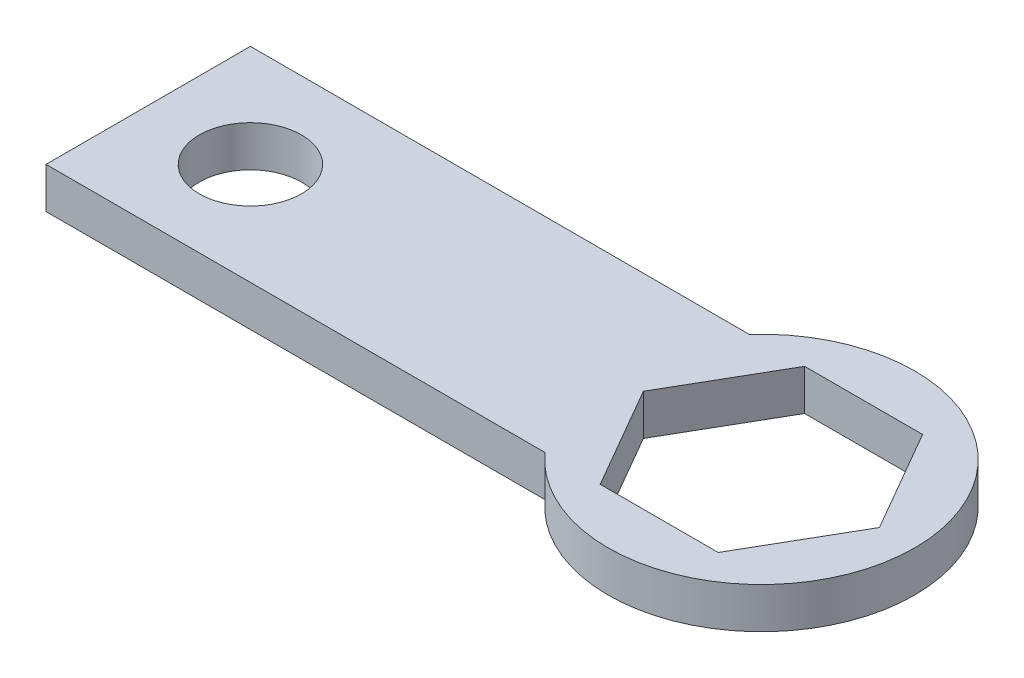
ISO-10303-21;
HEADER;
FILE_DESCRIPTION(('STEP AP214'),'2;1');
FILE_NAME('part.step','',(''),(''),'','','');
FILE_SCHEMA(('AUTOMOTIVE_DESIGN { 1 0 10303 214 1 1 1 1 }'));
ENDSEC;
DATA;
#1=APPLICATION_CONTEXT('core data for automotive mechanical design processes');
#2=APPLICATION_PROTOCOL_DEFINITION('international standard','automotive_design',2000,#1);
#3=PRODUCT_CONTEXT('',#1,'mechanical');
#4=PRODUCT('Part','Part','',(#3));
#5=PRODUCT_RELATED_PRODUCT_CATEGORY('part','',(#4));
#6=PRODUCT_DEFINITION_FORMATION('','',#4);
#7=PRODUCT_DEFINITION_CONTEXT('part definition',#1,'design');
#8=PRODUCT_DEFINITION('design','',#6,#7);
#9=PRODUCT_DEFINITION_SHAPE('','',#8);
#10=(LENGTH_UNIT() NAMED_UNIT(*) SI_UNIT(.MILLI.,.METRE.));
#11=(NAMED_UNIT(*) PLANE_ANGLE_UNIT() SI_UNIT($,.RADIAN.));
#12=(NAMED_UNIT(*) SI_UNIT($,.STERADIAN.) SOLID_ANGLE_UNIT());
#13=UNCERTAINTY_MEASURE_WITH_UNIT(LENGTH_MEASURE(1.E-05),#10,'distance_accuracy_value','');
#14=(GEOMETRIC_REPRESENTATION_CONTEXT(3) GLOBAL_UNCERTAINTY_ASSIGNED_CONTEXT((#13)) GLOBAL_UNIT_ASSIGNED_CONTEXT((#10,
#11,#12)) REPRESENTATION_CONTEXT('',''));
#15=CARTESIAN_POINT('',(0.,0.,0.));
#16=DIRECTION('',(0.,0.,1.));
#17=DIRECTION('',(1.,0.,0.));
#18=AXIS2_PLACEMENT_3D('',#15,#16,#17);
#19=CARTESIAN_POINT('',(0.,1.27,0.));
#20=DIRECTION('',(0.,-1.,0.));
#21=DIRECTION('',(0.,0.,-1.));
#22=AXIS2_PLACEMENT_3D('',#19,#20,#21);
#23=CYLINDRICAL_SURFACE('',#22,4.7625);
#24=CARTESIAN_POINT('',(0.,0.,0.));
#25=DIRECTION('',(0.,1.,0.));
#26=DIRECTION('',(0.,0.,1.));
#27=AXIS2_PLACEMENT_3D('',#24,#25,#26);
#28=CIRCLE('',#27,4.7625);
#29=CARTESIAN_POINT('',(-3.54975791428092,0.,3.175));
#30=VERTEX_POINT('',#29);
#31=CARTESIAN_POINT('',(-3.54975791428092,0.,-3.175));
#32=VERTEX_POINT('',#31);
#33=EDGE_CURVE('E162',#30,#32,#28,.T.);
#34=ORIENTED_EDGE('',*,*,#33,.T.);
#35=DIRECTION('',(0.,-1.,0.));
#36=VECTOR('',#35,1.);
#37=CARTESIAN_POINT('',(-3.54975791428092,1.27,-3.175));
#38=LINE('',#37,#36);
#39=CARTESIAN_POINT('',(-3.54975791428092,1.27,-3.175));
#40=VERTEX_POINT('',#39);
#41=EDGE_CURVE('E218',#40,#32,#38,.T.);
#42=ORIENTED_EDGE('',*,*,#41,.F.);
#43=CARTESIAN_POINT('',(0.,1.27,0.));
#44=DIRECTION('',(0.,1.,0.));
#45=DIRECTION('',(0.,0.,1.));
#46=AXIS2_PLACEMENT_3D('',#43,#44,#45);
#47=CIRCLE('',#46,4.7625);
#48=CARTESIAN_POINT('',(-3.54975791428092,1.27,3.175));
#49=VERTEX_POINT('',#48);
#50=EDGE_CURVE('E173',#49,#40,#47,.T.);
#51=ORIENTED_EDGE('',*,*,#50,.F.);
#52=DIRECTION('',(0.,-1.,0.));
#53=VECTOR('',#52,1.);
#54=CARTESIAN_POINT('',(-3.54975791428092,1.27,3.175));
#55=LINE('',#54,#53);
#56=EDGE_CURVE('E191',#49,#30,#55,.T.);
#57=ORIENTED_EDGE('',*,*,#56,.T.);
#58=EDGE_LOOP('',(#34,#42,#51,#57));
#59=FACE_BOUND('',#58,.T.);
#60=ADVANCED_FACE('F45',(#59),#23,.T.);
#61=CARTESIAN_POINT('',(0.,1.27,-3.175));
#62=DIRECTION('',(0.,0.,1.));
#63=DIRECTION('',(1.,0.,0.));
#64=AXIS2_PLACEMENT_3D('',#61,#62,#63);
#65=PLANE('',#64);
#66=DIRECTION('',(-1.,0.,0.));
#67=VECTOR('',#66,1.);
#68=CARTESIAN_POINT('',(0.,0.,-3.175));
#69=LINE('',#68,#67);
#70=CARTESIAN_POINT('',(-19.05,0.,-3.175));
#71=VERTEX_POINT('',#70);
#72=EDGE_CURVE('E195',#32,#71,#69,.T.);
#73=ORIENTED_EDGE('',*,*,#72,.T.);
#74=DIRECTION('',(0.,-1.,0.));
#75=VECTOR('',#74,1.);
#76=CARTESIAN_POINT('',(-19.05,1.27,-3.175));
#77=LINE('',#76,#75);
#78=CARTESIAN_POINT('',(-19.05,1.27,-3.175));
#79=VERTEX_POINT('',#78);
#80=EDGE_CURVE('E214',#79,#71,#77,.T.);
#81=ORIENTED_EDGE('',*,*,#80,.F.);
#82=DIRECTION('',(-1.,0.,0.));
#83=VECTOR('',#82,1.);
#84=CARTESIAN_POINT('',(0.,1.27,-3.175));
#85=LINE('',#84,#83);
#86=EDGE_CURVE('E177',#40,#79,#85,.T.);
#87=ORIENTED_EDGE('',*,*,#86,.F.);
#88=ORIENTED_EDGE('',*,*,#41,.T.);
#89=EDGE_LOOP('',(#73,#81,#87,#88));
#90=FACE_BOUND('',#89,.T.);
#91=ADVANCED_FACE('F262',(#90),#65,.F.);
#92=CARTESIAN_POINT('',(-19.05,1.27,0.));
#93=DIRECTION('',(1.,0.,0.));
#94=DIRECTION('',(0.,0.,-1.));
#95=AXIS2_PLACEMENT_3D('',#92,#93,#94);
#96=PLANE('',#95);
#97=DIRECTION('',(0.,0.,1.));
#98=VECTOR('',#97,1.);
#99=CARTESIAN_POINT('',(-19.05,0.,0.));
#100=LINE('',#99,#98);
#101=CARTESIAN_POINT('',(-19.05,0.,3.175));
#102=VERTEX_POINT('',#101);
#103=EDGE_CURVE('E198',#71,#102,#100,.T.);
#104=ORIENTED_EDGE('',*,*,#103,.T.);
#105=DIRECTION('',(0.,-1.,0.));
#106=VECTOR('',#105,1.);
#107=CARTESIAN_POINT('',(-19.05,1.27,3.175));
#108=LINE('',#107,#106);
#109=CARTESIAN_POINT('',(-19.05,1.27,3.175));
#110=VERTEX_POINT('',#109);
#111=EDGE_CURVE('E210',#110,#102,#108,.T.);
#112=ORIENTED_EDGE('',*,*,#111,.F.);
#113=DIRECTION('',(0.,0.,1.));
#114=VECTOR('',#113,1.);
#115=CARTESIAN_POINT('',(-19.05,1.27,0.));
#116=LINE('',#115,#114);
#117=EDGE_CURVE('E181',#79,#110,#116,.T.);
#118=ORIENTED_EDGE('',*,*,#117,.F.);
#119=ORIENTED_EDGE('',*,*,#80,.T.);
#120=EDGE_LOOP('',(#104,#112,#118,#119));
#121=FACE_BOUND('',#120,.T.);
#122=ADVANCED_FACE('F267',(#121),#96,.F.);
#123=CARTESIAN_POINT('',(0.,1.27,3.175));
#124=DIRECTION('',(0.,0.,-1.));
#125=DIRECTION('',(-1.,0.,0.));
#126=AXIS2_PLACEMENT_3D('',#123,#124,#125);
#127=PLANE('',#126);
#128=DIRECTION('',(1.,0.,0.));
#129=VECTOR('',#128,1.);
#130=CARTESIAN_POINT('',(0.,0.,3.175));
#131=LINE('',#130,#129);
#132=EDGE_CURVE('E201',#102,#30,#131,.T.);
#133=ORIENTED_EDGE('',*,*,#132,.T.);
#134=ORIENTED_EDGE('',*,*,#56,.F.);
#135=DIRECTION('',(1.,0.,0.));
#136=VECTOR('',#135,1.);
#137=CARTESIAN_POINT('',(0.,1.27,3.175));
#138=LINE('',#137,#136);
#139=EDGE_CURVE('E184',#110,#49,#138,.T.);
#140=ORIENTED_EDGE('',*,*,#139,.F.);
#141=ORIENTED_EDGE('',*,*,#111,.T.);
#142=EDGE_LOOP('',(#133,#134,#140,#141));
#143=FACE_BOUND('',#142,.T.);
#144=ADVANCED_FACE('F282',(#143),#127,.F.);
#145=CARTESIAN_POINT('',(-15.875,1.27,0.));
#146=DIRECTION('',(0.,-1.,0.));
#147=DIRECTION('',(0.,0.,-1.));
#148=AXIS2_PLACEMENT_3D('',#145,#146,#147);
#149=CYLINDRICAL_SURFACE('',#148,1.5875);
#150=CARTESIAN_POINT('',(-15.875,1.27,0.));
#151=DIRECTION('',(0.,1.,0.));
#152=DIRECTION('',(0.,0.,1.));
#153=AXIS2_PLACEMENT_3D('',#150,#151,#152);
#154=CIRCLE('',#153,1.5875);
#155=CARTESIAN_POINT('',(-15.875,1.27,1.5875));
#156=VERTEX_POINT('',#155);
#157=EDGE_CURVE('E187',#156,#156,#154,.T.);
#158=ORIENTED_EDGE('',*,*,#157,.T.);
#159=EDGE_LOOP('',(#158));
#160=FACE_BOUND('',#159,.T.);
#161=CARTESIAN_POINT('',(-15.875,0.,0.));
#162=DIRECTION('',(0.,1.,0.));
#163=DIRECTION('',(0.,0.,1.));
#164=AXIS2_PLACEMENT_3D('',#161,#162,#163);
#165=CIRCLE('',#164,1.5875);
#166=CARTESIAN_POINT('',(-15.875,0.,1.5875));
#167=VERTEX_POINT('',#166);
#168=EDGE_CURVE('E178',#167,#167,#165,.T.);
#169=ORIENTED_EDGE('',*,*,#168,.F.);
#170=EDGE_LOOP('',(#169));
#171=FACE_BOUND('',#170,.T.);
#172=ADVANCED_FACE('F289',(#160,#171),#149,.F.);
#173=CARTESIAN_POINT('',(0.,1.27,0.));
#174=DIRECTION('',(0.,1.,0.));
#175=DIRECTION('',(0.,0.,1.));
#176=AXIS2_PLACEMENT_3D('',#173,#174,#175);
#177=PLANE('',#176);
#178=DIRECTION('',(0.5,0.,-0.866025403784439));
#179=VECTOR('',#178,1.);
#180=CARTESIAN_POINT('',(1.83308710467706,1.27,3.175));
#181=LINE('',#180,#179);
#182=CARTESIAN_POINT('',(1.83308710467706,1.27,3.175));
#183=VERTEX_POINT('',#182);
#184=CARTESIAN_POINT('',(3.66617420935412,1.27,0.));
#185=VERTEX_POINT('',#184);
#186=EDGE_CURVE('E60',#183,#185,#181,.T.);
#187=ORIENTED_EDGE('',*,*,#186,.F.);
#188=DIRECTION('',(1.,0.,0.));
#189=VECTOR('',#188,1.);
#190=CARTESIAN_POINT('',(-1.83308710467706,1.27,3.175));
#191=LINE('',#190,#189);
#192=CARTESIAN_POINT('',(-1.83308710467706,1.27,3.175));
#193=VERTEX_POINT('',#192);
#194=EDGE_CURVE('E155',#193,#183,#191,.T.);
#195=ORIENTED_EDGE('',*,*,#194,.F.);
#196=DIRECTION('',(0.5,0.,0.866025403784439));
#197=VECTOR('',#196,1.);
#198=CARTESIAN_POINT('',(-3.66617420935412,1.27,0.));
#199=LINE('',#198,#197);
#200=CARTESIAN_POINT('',(-3.66617420935412,1.27,0.));
#201=VERTEX_POINT('',#200);
#202=EDGE_CURVE('E148',#201,#193,#199,.T.);
#203=ORIENTED_EDGE('',*,*,#202,.F.);
#204=DIRECTION('',(-0.5,0.,0.866025403784439));
#205=VECTOR('',#204,1.);
#206=CARTESIAN_POINT('',(-1.83308710467706,1.27,-3.175));
#207=LINE('',#206,#205);
#208=CARTESIAN_POINT('',(-1.83308710467706,1.27,-3.175));
#209=VERTEX_POINT('',#208);
#210=EDGE_CURVE('E144',#209,#201,#207,.T.);
#211=ORIENTED_EDGE('',*,*,#210,.F.);
#212=DIRECTION('',(-1.,0.,0.));
#213=VECTOR('',#212,1.);
#214=CARTESIAN_POINT('',(1.83308710467706,1.27,-3.175));
#215=LINE('',#214,#213);
#216=CARTESIAN_POINT('',(1.83308710467706,1.27,-3.175));
#217=VERTEX_POINT('',#216);
#218=EDGE_CURVE('E125',#217,#209,#215,.T.);
#219=ORIENTED_EDGE('',*,*,#218,.F.);
#220=DIRECTION('',(-0.5,0.,-0.866025403784438));
#221=VECTOR('',#220,1.);
#222=CARTESIAN_POINT('',(3.66617420935412,1.27,0.));
#223=LINE('',#222,#221);
#224=EDGE_CURVE('E135',#185,#217,#223,.T.);
#225=ORIENTED_EDGE('',*,*,#224,.F.);
#226=EDGE_LOOP('',(#187,#195,#203,#211,#219,#225));
#227=FACE_BOUND('',#226,.T.);
#228=ORIENTED_EDGE('',*,*,#50,.T.);
#229=ORIENTED_EDGE('',*,*,#86,.T.);
#230=ORIENTED_EDGE('',*,*,#117,.T.);
#231=ORIENTED_EDGE('',*,*,#139,.T.);
#232=EDGE_LOOP('',(#228,#229,#230,#231));
#233=FACE_BOUND('',#232,.T.);
#234=ORIENTED_EDGE('',*,*,#157,.F.);
#235=EDGE_LOOP('',(#234));
#236=FACE_BOUND('',#235,.T.);
#237=ADVANCED_FACE('F140',(#227,#233,#236),#177,.T.);
#238=CARTESIAN_POINT('',(0.,0.,0.));
#239=DIRECTION('',(0.,1.,0.));
#240=DIRECTION('',(0.,0.,1.));
#241=AXIS2_PLACEMENT_3D('',#238,#239,#240);
#242=PLANE('',#241);
#243=DIRECTION('',(1.,0.,0.));
#244=VECTOR('',#243,1.);
#245=CARTESIAN_POINT('',(0.,0.,3.175));
#246=LINE('',#245,#244);
#247=CARTESIAN_POINT('',(-1.83308710467706,0.,3.175));
#248=VERTEX_POINT('',#247);
#249=CARTESIAN_POINT('',(1.83308710467706,0.,3.175));
#250=VERTEX_POINT('',#249);
#251=EDGE_CURVE('E53',#248,#250,#246,.T.);
#252=ORIENTED_EDGE('',*,*,#251,.T.);
#253=DIRECTION('',(0.5,0.,-0.866025403784439));
#254=VECTOR('',#253,1.);
#255=CARTESIAN_POINT('',(2.74963065701559,0.,1.5875));
#256=LINE('',#255,#254);
#257=CARTESIAN_POINT('',(3.66617420935412,0.,0.));
#258=VERTEX_POINT('',#257);
#259=EDGE_CURVE('E11',#250,#258,#256,.T.);
#260=ORIENTED_EDGE('',*,*,#259,.T.);
#261=DIRECTION('',(-0.5,0.,-0.866025403784438));
#262=VECTOR('',#261,1.);
#263=CARTESIAN_POINT('',(2.74963065701559,0.,-1.5875));
#264=LINE('',#263,#262);
#265=CARTESIAN_POINT('',(1.83308710467706,0.,-3.175));
#266=VERTEX_POINT('',#265);
#267=EDGE_CURVE('E222',#258,#266,#264,.T.);
#268=ORIENTED_EDGE('',*,*,#267,.T.);
#269=DIRECTION('',(-1.,0.,0.));
#270=VECTOR('',#269,1.);
#271=CARTESIAN_POINT('',(0.,0.,-3.175));
#272=LINE('',#271,#270);
#273=CARTESIAN_POINT('',(-1.83308710467706,0.,-3.175));
#274=VERTEX_POINT('',#273);
#275=EDGE_CURVE('E128',#266,#274,#272,.T.);
#276=ORIENTED_EDGE('',*,*,#275,.T.);
#277=DIRECTION('',(-0.5,0.,0.866025403784439));
#278=VECTOR('',#277,1.);
#279=CARTESIAN_POINT('',(-2.74963065701559,0.,-1.5875));
#280=LINE('',#279,#278);
#281=CARTESIAN_POINT('',(-3.66617420935412,0.,0.));
#282=VERTEX_POINT('',#281);
#283=EDGE_CURVE('E227',#274,#282,#280,.T.);
#284=ORIENTED_EDGE('',*,*,#283,.T.);
#285=DIRECTION('',(0.5,0.,0.866025403784439));
#286=VECTOR('',#285,1.);
#287=CARTESIAN_POINT('',(-2.74963065701559,0.,1.5875));
#288=LINE('',#287,#286);
#289=EDGE_CURVE('E231',#282,#248,#288,.T.);
#290=ORIENTED_EDGE('',*,*,#289,.T.);
#291=EDGE_LOOP('',(#252,#260,#268,#276,#284,#290));
#292=FACE_BOUND('',#291,.T.);
#293=ORIENTED_EDGE('',*,*,#33,.F.);
#294=ORIENTED_EDGE('',*,*,#132,.F.);
#295=ORIENTED_EDGE('',*,*,#103,.F.);
#296=ORIENTED_EDGE('',*,*,#72,.F.);
#297=EDGE_LOOP('',(#293,#294,#295,#296));
#298=FACE_BOUND('',#297,.T.);
#299=ORIENTED_EDGE('',*,*,#168,.T.);
#300=EDGE_LOOP('',(#299));
#301=FACE_BOUND('',#300,.T.);
#302=ADVANCED_FACE('F237',(#292,#298,#301),#242,.F.);
#303=CARTESIAN_POINT('',(1.83308710467706,-1.27,3.175));
#304=DIRECTION('',(0.866025403784439,0.,0.5));
#305=DIRECTION('',(0.5,0.,-0.866025403784439));
#306=AXIS2_PLACEMENT_3D('',#303,#304,#305);
#307=PLANE('',#306);
#308=DIRECTION('',(0.,1.,0.));
#309=VECTOR('',#308,1.);
#310=CARTESIAN_POINT('',(1.83308710467706,-1.27,3.175));
#311=LINE('',#310,#309);
#312=EDGE_CURVE('E159',#250,#183,#311,.T.);
#313=ORIENTED_EDGE('',*,*,#312,.T.);
#314=ORIENTED_EDGE('',*,*,#186,.T.);
#315=DIRECTION('',(0.,1.,0.));
#316=VECTOR('',#315,1.);
#317=CARTESIAN_POINT('',(3.66617420935412,-1.27,0.));
#318=LINE('',#317,#316);
#319=EDGE_CURVE('E132',#258,#185,#318,.T.);
#320=ORIENTED_EDGE('',*,*,#319,.F.);
#321=ORIENTED_EDGE('',*,*,#259,.F.);
#322=EDGE_LOOP('',(#313,#314,#320,#321));
#323=FACE_BOUND('',#322,.T.);
#324=ADVANCED_FACE('F250',(#323),#307,.F.);
#325=CARTESIAN_POINT('',(-1.83308710467706,-1.27,3.175));
#326=DIRECTION('',(0.,0.,1.));
#327=DIRECTION('',(1.,0.,0.));
#328=AXIS2_PLACEMENT_3D('',#325,#326,#327);
#329=PLANE('',#328);
#330=DIRECTION('',(0.,1.,0.));
#331=VECTOR('',#330,1.);
#332=CARTESIAN_POINT('',(-1.83308710467706,-1.27,3.175));
#333=LINE('',#332,#331);
#334=EDGE_CURVE('E163',#248,#193,#333,.T.);
#335=ORIENTED_EDGE('',*,*,#334,.T.);
#336=ORIENTED_EDGE('',*,*,#194,.T.);
#337=ORIENTED_EDGE('',*,*,#312,.F.);
#338=ORIENTED_EDGE('',*,*,#251,.F.);
#339=EDGE_LOOP('',(#335,#336,#337,#338));
#340=FACE_BOUND('',#339,.T.);
#341=ADVANCED_FACE('F242',(#340),#329,.F.);
#342=CARTESIAN_POINT('',(-3.66617420935412,-1.27,0.));
#343=DIRECTION('',(-0.866025403784439,0.,0.5));
#344=DIRECTION('',(0.5,0.,0.866025403784439));
#345=AXIS2_PLACEMENT_3D('',#342,#343,#344);
#346=PLANE('',#345);
#347=DIRECTION('',(0.,1.,0.));
#348=VECTOR('',#347,1.);
#349=CARTESIAN_POINT('',(-3.66617420935412,-1.27,0.));
#350=LINE('',#349,#348);
#351=EDGE_CURVE('E166',#282,#201,#350,.T.);
#352=ORIENTED_EDGE('',*,*,#351,.T.);
#353=ORIENTED_EDGE('',*,*,#202,.T.);
#354=ORIENTED_EDGE('',*,*,#334,.F.);
#355=ORIENTED_EDGE('',*,*,#289,.F.);
#356=EDGE_LOOP('',(#352,#353,#354,#355));
#357=FACE_BOUND('',#356,.T.);
#358=ADVANCED_FACE('F244',(#357),#346,.F.);
#359=CARTESIAN_POINT('',(-1.83308710467706,-1.27,-3.175));
#360=DIRECTION('',(-0.866025403784439,0.,-0.5));
#361=DIRECTION('',(-0.5,0.,0.866025403784439));
#362=AXIS2_PLACEMENT_3D('',#359,#360,#361);
#363=PLANE('',#362);
#364=DIRECTION('',(0.,1.,0.));
#365=VECTOR('',#364,1.);
#366=CARTESIAN_POINT('',(-1.83308710467706,-1.27,-3.175));
#367=LINE('',#366,#365);
#368=EDGE_CURVE('E131',#274,#209,#367,.T.);
#369=ORIENTED_EDGE('',*,*,#368,.T.);
#370=ORIENTED_EDGE('',*,*,#210,.T.);
#371=ORIENTED_EDGE('',*,*,#351,.F.);
#372=ORIENTED_EDGE('',*,*,#283,.F.);
#373=EDGE_LOOP('',(#369,#370,#371,#372));
#374=FACE_BOUND('',#373,.T.);
#375=ADVANCED_FACE('F249',(#374),#363,.F.);
#376=CARTESIAN_POINT('',(1.83308710467706,-1.27,-3.175));
#377=DIRECTION('',(0.,0.,-1.));
#378=DIRECTION('',(-1.,0.,0.));
#379=AXIS2_PLACEMENT_3D('',#376,#377,#378);
#380=PLANE('',#379);
#381=DIRECTION('',(0.,1.,0.));
#382=VECTOR('',#381,1.);
#383=CARTESIAN_POINT('',(1.83308710467706,-1.27,-3.175));
#384=LINE('',#383,#382);
#385=EDGE_CURVE('E68',#266,#217,#384,.T.);
#386=ORIENTED_EDGE('',*,*,#385,.T.);
#387=ORIENTED_EDGE('',*,*,#218,.T.);
#388=ORIENTED_EDGE('',*,*,#368,.F.);
#389=ORIENTED_EDGE('',*,*,#275,.F.);
#390=EDGE_LOOP('',(#386,#387,#388,#389));
#391=FACE_BOUND('',#390,.T.);
#392=ADVANCED_FACE('F122',(#391),#380,.F.);
#393=CARTESIAN_POINT('',(3.66617420935412,-1.27,0.));
#394=DIRECTION('',(0.866025403784438,0.,-0.5));
#395=DIRECTION('',(-0.5,0.,-0.866025403784438));
#396=AXIS2_PLACEMENT_3D('',#393,#394,#395);
#397=PLANE('',#396);
#398=ORIENTED_EDGE('',*,*,#319,.T.);
#399=ORIENTED_EDGE('',*,*,#224,.T.);
#400=ORIENTED_EDGE('',*,*,#385,.F.);
#401=ORIENTED_EDGE('',*,*,#267,.F.);
#402=EDGE_LOOP('',(#398,#399,#400,#401));
#403=FACE_BOUND('',#402,.T.);
#404=ADVANCED_FACE('F136',(#403),#397,.F.);
#405=CLOSED_SHELL('',(#60,#91,#122,#144,#172,#237,#302,#324,#341,#358,#375,#392,#404));
#406=MANIFOLD_SOLID_BREP('B2',#405);
#407=ADVANCED_BREP_SHAPE_REPRESENTATION('',(#18,#406),#14);
#408=SHAPE_DEFINITION_REPRESENTATION(#9,#407);
ENDSEC;
END-ISO-10303-21;
